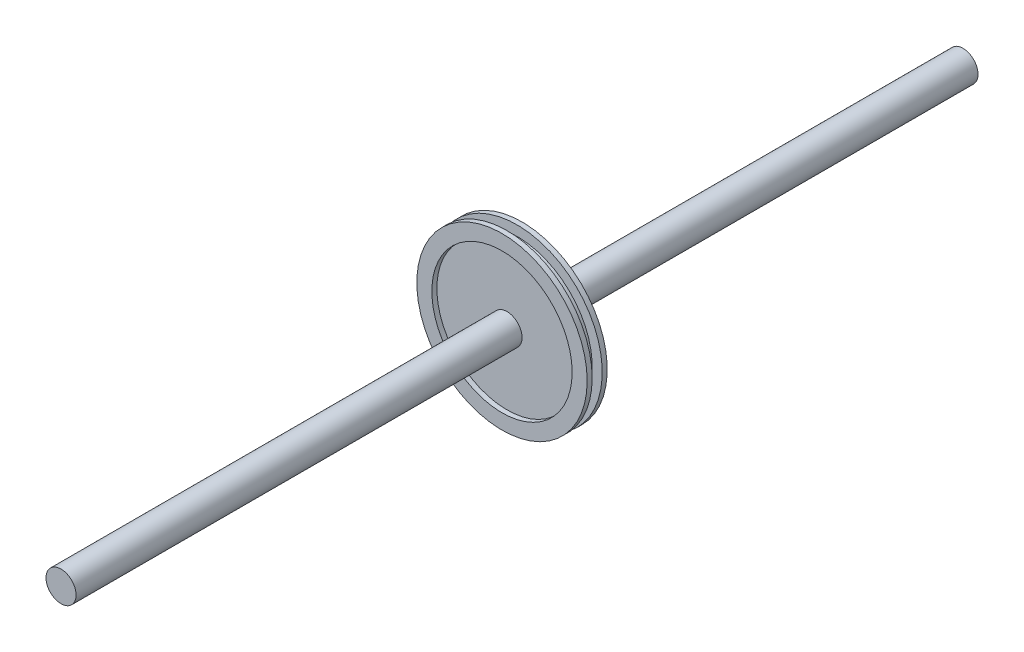
ISO-10303-21;
HEADER;
FILE_DESCRIPTION(('STEP AP214'),'2;1');
FILE_NAME('part.step','',(''),(''),'','','');
FILE_SCHEMA(('AUTOMOTIVE_DESIGN { 1 0 10303 214 1 1 1 1 }'));
ENDSEC;
DATA;
#1=APPLICATION_CONTEXT('core data for automotive mechanical design processes');
#2=APPLICATION_PROTOCOL_DEFINITION('international standard','automotive_design',2000,#1);
#3=PRODUCT_CONTEXT('',#1,'mechanical');
#4=PRODUCT('Part','Part','',(#3));
#5=PRODUCT_RELATED_PRODUCT_CATEGORY('part','',(#4));
#6=PRODUCT_DEFINITION_FORMATION('','',#4);
#7=PRODUCT_DEFINITION_CONTEXT('part definition',#1,'design');
#8=PRODUCT_DEFINITION('design','',#6,#7);
#9=PRODUCT_DEFINITION_SHAPE('','',#8);
#10=(LENGTH_UNIT() NAMED_UNIT(*) SI_UNIT(.MILLI.,.METRE.));
#11=(NAMED_UNIT(*) PLANE_ANGLE_UNIT() SI_UNIT($,.RADIAN.));
#12=(NAMED_UNIT(*) SI_UNIT($,.STERADIAN.) SOLID_ANGLE_UNIT());
#13=UNCERTAINTY_MEASURE_WITH_UNIT(LENGTH_MEASURE(1.E-05),#10,'distance_accuracy_value','');
#14=(GEOMETRIC_REPRESENTATION_CONTEXT(3) GLOBAL_UNCERTAINTY_ASSIGNED_CONTEXT((#13)) GLOBAL_UNIT_ASSIGNED_CONTEXT((#10,
#11,#12)) REPRESENTATION_CONTEXT('',''));
#15=CARTESIAN_POINT('',(0.,0.,0.));
#16=DIRECTION('',(0.,0.,1.));
#17=DIRECTION('',(1.,0.,0.));
#18=AXIS2_PLACEMENT_3D('',#15,#16,#17);
#19=CARTESIAN_POINT('',(0.,0.,0.5));
#20=DIRECTION('',(0.,0.,-1.));
#21=DIRECTION('',(-1.,0.,0.));
#22=AXIS2_PLACEMENT_3D('',#19,#20,#21);
#23=CYLINDRICAL_SURFACE('',#22,7.5);
#24=CARTESIAN_POINT('',(0.,0.,0.5));
#25=DIRECTION('',(0.,0.,1.));
#26=DIRECTION('',(1.,0.,0.));
#27=AXIS2_PLACEMENT_3D('',#24,#25,#26);
#28=CIRCLE('',#27,7.5);
#29=CARTESIAN_POINT('',(7.5,0.,0.5));
#30=VERTEX_POINT('',#29);
#31=EDGE_CURVE('E49',#30,#30,#28,.T.);
#32=ORIENTED_EDGE('',*,*,#31,.F.);
#33=EDGE_LOOP('',(#32));
#34=FACE_BOUND('',#33,.T.);
#35=CARTESIAN_POINT('',(0.,0.,-0.5));
#36=DIRECTION('',(0.,0.,-1.));
#37=DIRECTION('',(-1.,0.,0.));
#38=AXIS2_PLACEMENT_3D('',#35,#36,#37);
#39=CIRCLE('',#38,7.5);
#40=CARTESIAN_POINT('',(-7.5,0.,-0.5));
#41=VERTEX_POINT('',#40);
#42=EDGE_CURVE('E64',#41,#41,#39,.T.);
#43=ORIENTED_EDGE('',*,*,#42,.F.);
#44=EDGE_LOOP('',(#43));
#45=FACE_BOUND('',#44,.T.);
#46=ADVANCED_FACE('F39',(#34,#45),#23,.T.);
#47=CARTESIAN_POINT('',(0.,0.,1.));
#48=DIRECTION('',(0.,0.,1.));
#49=DIRECTION('',(1.,0.,0.));
#50=AXIS2_PLACEMENT_3D('',#47,#48,#49);
#51=PLANE('',#50);
#52=CARTESIAN_POINT('',(0.,0.,1.));
#53=DIRECTION('',(0.,0.,1.));
#54=DIRECTION('',(1.,0.,0.));
#55=AXIS2_PLACEMENT_3D('',#52,#53,#54);
#56=CIRCLE('',#55,8.5);
#57=CARTESIAN_POINT('',(8.5,0.,1.));
#58=VERTEX_POINT('',#57);
#59=EDGE_CURVE('E53',#58,#58,#56,.T.);
#60=ORIENTED_EDGE('',*,*,#59,.T.);
#61=EDGE_LOOP('',(#60));
#62=FACE_BOUND('',#61,.T.);
#63=CARTESIAN_POINT('',(0.,0.,1.));
#64=DIRECTION('',(0.,0.,1.));
#65=DIRECTION('',(1.,0.,0.));
#66=AXIS2_PLACEMENT_3D('',#63,#64,#65);
#67=CIRCLE('',#66,7.);
#68=CARTESIAN_POINT('',(7.,0.,1.));
#69=VERTEX_POINT('',#68);
#70=EDGE_CURVE('E59',#69,#69,#67,.T.);
#71=ORIENTED_EDGE('',*,*,#70,.F.);
#72=EDGE_LOOP('',(#71));
#73=FACE_BOUND('',#72,.T.);
#74=ADVANCED_FACE('F107',(#62,#73),#51,.T.);
#75=CARTESIAN_POINT('',(0.,0.,0.5));
#76=DIRECTION('',(0.,0.,1.));
#77=DIRECTION('',(1.,0.,0.));
#78=AXIS2_PLACEMENT_3D('',#75,#76,#77);
#79=PLANE('',#78);
#80=ORIENTED_EDGE('',*,*,#31,.T.);
#81=EDGE_LOOP('',(#80));
#82=FACE_BOUND('',#81,.T.);
#83=CARTESIAN_POINT('',(0.,0.,0.5));
#84=DIRECTION('',(0.,0.,1.));
#85=DIRECTION('',(1.,0.,0.));
#86=AXIS2_PLACEMENT_3D('',#83,#84,#85);
#87=CIRCLE('',#86,8.5);
#88=CARTESIAN_POINT('',(8.5,0.,0.5));
#89=VERTEX_POINT('',#88);
#90=EDGE_CURVE('E56',#89,#89,#87,.T.);
#91=ORIENTED_EDGE('',*,*,#90,.F.);
#92=EDGE_LOOP('',(#91));
#93=FACE_BOUND('',#92,.T.);
#94=ADVANCED_FACE('F112',(#82,#93),#79,.F.);
#95=CARTESIAN_POINT('',(0.,0.,1.));
#96=DIRECTION('',(0.,0.,-1.));
#97=DIRECTION('',(-1.,0.,0.));
#98=AXIS2_PLACEMENT_3D('',#95,#96,#97);
#99=CYLINDRICAL_SURFACE('',#98,8.5);
#100=ORIENTED_EDGE('',*,*,#59,.F.);
#101=EDGE_LOOP('',(#100));
#102=FACE_BOUND('',#101,.T.);
#103=ORIENTED_EDGE('',*,*,#90,.T.);
#104=EDGE_LOOP('',(#103));
#105=FACE_BOUND('',#104,.T.);
#106=ADVANCED_FACE('F142',(#102,#105),#99,.T.);
#107=CARTESIAN_POINT('',(0.,0.,1.));
#108=DIRECTION('',(0.,0.,-1.));
#109=DIRECTION('',(-1.,0.,0.));
#110=AXIS2_PLACEMENT_3D('',#107,#108,#109);
#111=CYLINDRICAL_SURFACE('',#110,7.);
#112=ORIENTED_EDGE('',*,*,#70,.T.);
#113=EDGE_LOOP('',(#112));
#114=FACE_BOUND('',#113,.T.);
#115=CARTESIAN_POINT('',(0.,0.,0.5));
#116=DIRECTION('',(0.,0.,1.));
#117=DIRECTION('',(1.,0.,0.));
#118=AXIS2_PLACEMENT_3D('',#115,#116,#117);
#119=CIRCLE('',#118,7.);
#120=CARTESIAN_POINT('',(7.,0.,0.5));
#121=VERTEX_POINT('',#120);
#122=EDGE_CURVE('E45',#121,#121,#119,.F.);
#123=ORIENTED_EDGE('',*,*,#122,.T.);
#124=EDGE_LOOP('',(#123));
#125=FACE_BOUND('',#124,.T.);
#126=ADVANCED_FACE('F139',(#114,#125),#111,.F.);
#127=CARTESIAN_POINT('',(0.,0.,0.5));
#128=DIRECTION('',(0.,0.,1.));
#129=DIRECTION('',(1.,0.,0.));
#130=AXIS2_PLACEMENT_3D('',#127,#128,#129);
#131=PLANE('',#130);
#132=CARTESIAN_POINT('',(0.,0.,0.5));
#133=DIRECTION('',(0.,0.,1.));
#134=DIRECTION('',(1.,0.,0.));
#135=AXIS2_PLACEMENT_3D('',#132,#133,#134);
#136=CIRCLE('',#135,1.5);
#137=CARTESIAN_POINT('',(-1.5,0.,0.499999999999994));
#138=VERTEX_POINT('',#137);
#139=EDGE_CURVE('E77',#138,#138,#136,.F.);
#140=ORIENTED_EDGE('',*,*,#139,.T.);
#141=EDGE_LOOP('',(#140));
#142=FACE_BOUND('',#141,.T.);
#143=ORIENTED_EDGE('',*,*,#122,.F.);
#144=EDGE_LOOP('',(#143));
#145=FACE_BOUND('',#144,.T.);
#146=ADVANCED_FACE('F141',(#142,#145),#131,.T.);
#147=CARTESIAN_POINT('',(0.,0.,-1.));
#148=DIRECTION('',(0.,0.,-1.));
#149=DIRECTION('',(-1.,0.,0.));
#150=AXIS2_PLACEMENT_3D('',#147,#148,#149);
#151=PLANE('',#150);
#152=CARTESIAN_POINT('',(0.,0.,-1.));
#153=DIRECTION('',(0.,0.,-1.));
#154=DIRECTION('',(-1.,0.,0.));
#155=AXIS2_PLACEMENT_3D('',#152,#153,#154);
#156=CIRCLE('',#155,8.5);
#157=CARTESIAN_POINT('',(-8.5,0.,-1.));
#158=VERTEX_POINT('',#157);
#159=EDGE_CURVE('E67',#158,#158,#156,.T.);
#160=ORIENTED_EDGE('',*,*,#159,.T.);
#161=EDGE_LOOP('',(#160));
#162=FACE_BOUND('',#161,.T.);
#163=CARTESIAN_POINT('',(0.,0.,-1.));
#164=DIRECTION('',(0.,0.,-1.));
#165=DIRECTION('',(-1.,0.,0.));
#166=AXIS2_PLACEMENT_3D('',#163,#164,#165);
#167=CIRCLE('',#166,7.);
#168=CARTESIAN_POINT('',(-7.,0.,-1.));
#169=VERTEX_POINT('',#168);
#170=EDGE_CURVE('E71',#169,#169,#167,.T.);
#171=ORIENTED_EDGE('',*,*,#170,.F.);
#172=EDGE_LOOP('',(#171));
#173=FACE_BOUND('',#172,.T.);
#174=ADVANCED_FACE('F123',(#162,#173),#151,.T.);
#175=CARTESIAN_POINT('',(0.,0.,-0.5));
#176=DIRECTION('',(0.,0.,-1.));
#177=DIRECTION('',(-1.,0.,0.));
#178=AXIS2_PLACEMENT_3D('',#175,#176,#177);
#179=PLANE('',#178);
#180=ORIENTED_EDGE('',*,*,#42,.T.);
#181=EDGE_LOOP('',(#180));
#182=FACE_BOUND('',#181,.T.);
#183=CARTESIAN_POINT('',(0.,0.,-0.5));
#184=DIRECTION('',(0.,0.,-1.));
#185=DIRECTION('',(-1.,0.,0.));
#186=AXIS2_PLACEMENT_3D('',#183,#184,#185);
#187=CIRCLE('',#186,8.5);
#188=CARTESIAN_POINT('',(-8.5,0.,-0.5));
#189=VERTEX_POINT('',#188);
#190=EDGE_CURVE('E68',#189,#189,#187,.T.);
#191=ORIENTED_EDGE('',*,*,#190,.F.);
#192=EDGE_LOOP('',(#191));
#193=FACE_BOUND('',#192,.T.);
#194=ADVANCED_FACE('F119',(#182,#193),#179,.F.);
#195=CARTESIAN_POINT('',(0.,0.,-1.));
#196=DIRECTION('',(0.,0.,1.));
#197=DIRECTION('',(1.,0.,0.));
#198=AXIS2_PLACEMENT_3D('',#195,#196,#197);
#199=CYLINDRICAL_SURFACE('',#198,8.5);
#200=ORIENTED_EDGE('',*,*,#159,.F.);
#201=EDGE_LOOP('',(#200));
#202=FACE_BOUND('',#201,.T.);
#203=ORIENTED_EDGE('',*,*,#190,.T.);
#204=EDGE_LOOP('',(#203));
#205=FACE_BOUND('',#204,.T.);
#206=ADVANCED_FACE('F122',(#202,#205),#199,.T.);
#207=CARTESIAN_POINT('',(0.,0.,-1.));
#208=DIRECTION('',(0.,0.,1.));
#209=DIRECTION('',(1.,0.,0.));
#210=AXIS2_PLACEMENT_3D('',#207,#208,#209);
#211=CYLINDRICAL_SURFACE('',#210,7.);
#212=ORIENTED_EDGE('',*,*,#170,.T.);
#213=EDGE_LOOP('',(#212));
#214=FACE_BOUND('',#213,.T.);
#215=CARTESIAN_POINT('',(0.,0.,-0.5));
#216=DIRECTION('',(0.,0.,-1.));
#217=DIRECTION('',(-1.,0.,0.));
#218=AXIS2_PLACEMENT_3D('',#215,#216,#217);
#219=CIRCLE('',#218,7.);
#220=CARTESIAN_POINT('',(-7.,0.,-0.5));
#221=VERTEX_POINT('',#220);
#222=EDGE_CURVE('E74',#221,#221,#219,.T.);
#223=ORIENTED_EDGE('',*,*,#222,.F.);
#224=EDGE_LOOP('',(#223));
#225=FACE_BOUND('',#224,.T.);
#226=ADVANCED_FACE('F128',(#214,#225),#211,.F.);
#227=CARTESIAN_POINT('',(0.,0.,-0.5));
#228=DIRECTION('',(0.,0.,1.));
#229=DIRECTION('',(1.,0.,0.));
#230=AXIS2_PLACEMENT_3D('',#227,#228,#229);
#231=PLANE('',#230);
#232=CARTESIAN_POINT('',(0.,0.,-0.5));
#233=DIRECTION('',(0.,0.,1.));
#234=DIRECTION('',(1.,0.,0.));
#235=AXIS2_PLACEMENT_3D('',#232,#233,#234);
#236=CIRCLE('',#235,1.5);
#237=CARTESIAN_POINT('',(-1.5,0.,-0.500000000000007));
#238=VERTEX_POINT('',#237);
#239=EDGE_CURVE('E10',#238,#238,#236,.F.);
#240=ORIENTED_EDGE('',*,*,#239,.F.);
#241=EDGE_LOOP('',(#240));
#242=FACE_BOUND('',#241,.T.);
#243=ORIENTED_EDGE('',*,*,#222,.T.);
#244=EDGE_LOOP('',(#243));
#245=FACE_BOUND('',#244,.T.);
#246=ADVANCED_FACE('F134',(#242,#245),#231,.F.);
#247=CARTESIAN_POINT('',(0.,0.,-45.));
#248=DIRECTION('',(0.,0.,1.));
#249=DIRECTION('',(1.,0.,0.));
#250=AXIS2_PLACEMENT_3D('',#247,#248,#249);
#251=PLANE('',#250);
#252=CARTESIAN_POINT('',(0.,0.,-45.));
#253=DIRECTION('',(0.,0.,1.));
#254=DIRECTION('',(1.,0.,0.));
#255=AXIS2_PLACEMENT_3D('',#252,#253,#254);
#256=CIRCLE('',#255,1.5);
#257=CARTESIAN_POINT('',(-1.5,0.,-45.));
#258=VERTEX_POINT('',#257);
#259=EDGE_CURVE('E83',#258,#258,#256,.T.);
#260=ORIENTED_EDGE('',*,*,#259,.F.);
#261=EDGE_LOOP('',(#260));
#262=FACE_BOUND('',#261,.T.);
#263=ADVANCED_FACE('F101',(#262),#251,.F.);
#264=CARTESIAN_POINT('',(0.,0.,45.));
#265=DIRECTION('',(0.,0.,-1.));
#266=DIRECTION('',(-1.,0.,0.));
#267=AXIS2_PLACEMENT_3D('',#264,#265,#266);
#268=CYLINDRICAL_SURFACE('',#267,1.5);
#269=CARTESIAN_POINT('',(-1.5,0.,-45.));
#270=CARTESIAN_POINT('',(-1.5,0.,-44.5364583333333));
#271=CARTESIAN_POINT('',(-1.5,0.,-44.0729166666667));
#272=CARTESIAN_POINT('',(-1.5,0.,-43.1458333333333));
#273=CARTESIAN_POINT('',(-1.5,0.,-42.6822916666667));
#274=CARTESIAN_POINT('',(-1.5,0.,-41.7552083333333));
#275=CARTESIAN_POINT('',(-1.5,0.,-41.2916666666667));
#276=CARTESIAN_POINT('',(-1.5,0.,-40.3645833333333));
#277=CARTESIAN_POINT('',(-1.5,0.,-39.9010416666667));
#278=CARTESIAN_POINT('',(-1.5,0.,-38.9739583333333));
#279=CARTESIAN_POINT('',(-1.5,0.,-38.5104166666667));
#280=CARTESIAN_POINT('',(-1.5,0.,-37.5833333333333));
#281=CARTESIAN_POINT('',(-1.5,0.,-37.1197916666667));
#282=CARTESIAN_POINT('',(-1.5,0.,-36.1927083333333));
#283=CARTESIAN_POINT('',(-1.5,0.,-35.7291666666667));
#284=CARTESIAN_POINT('',(-1.5,0.,-34.8020833333333));
#285=CARTESIAN_POINT('',(-1.5,0.,-34.3385416666667));
#286=CARTESIAN_POINT('',(-1.5,0.,-33.4114583333333));
#287=CARTESIAN_POINT('',(-1.5,0.,-32.9479166666667));
#288=CARTESIAN_POINT('',(-1.5,0.,-32.0208333333333));
#289=CARTESIAN_POINT('',(-1.5,0.,-31.5572916666667));
#290=CARTESIAN_POINT('',(-1.5,0.,-30.6302083333333));
#291=CARTESIAN_POINT('',(-1.5,0.,-30.1666666666667));
#292=CARTESIAN_POINT('',(-1.5,0.,-29.2395833333333));
#293=CARTESIAN_POINT('',(-1.5,0.,-28.7760416666667));
#294=CARTESIAN_POINT('',(-1.5,0.,-27.8489583333333));
#295=CARTESIAN_POINT('',(-1.5,0.,-27.3854166666667));
#296=CARTESIAN_POINT('',(-1.5,0.,-26.4583333333333));
#297=CARTESIAN_POINT('',(-1.5,0.,-25.9947916666667));
#298=CARTESIAN_POINT('',(-1.5,0.,-25.0677083333333));
#299=CARTESIAN_POINT('',(-1.5,0.,-24.6041666666667));
#300=CARTESIAN_POINT('',(-1.5,0.,-23.6770833333333));
#301=CARTESIAN_POINT('',(-1.5,0.,-23.2135416666667));
#302=CARTESIAN_POINT('',(-1.5,0.,-22.2864583333333));
#303=CARTESIAN_POINT('',(-1.5,0.,-21.8229166666667));
#304=CARTESIAN_POINT('',(-1.5,0.,-20.8958333333333));
#305=CARTESIAN_POINT('',(-1.5,0.,-20.4322916666667));
#306=CARTESIAN_POINT('',(-1.5,0.,-19.5052083333333));
#307=CARTESIAN_POINT('',(-1.5,0.,-19.0416666666667));
#308=CARTESIAN_POINT('',(-1.5,0.,-18.1145833333333));
#309=CARTESIAN_POINT('',(-1.5,0.,-17.6510416666667));
#310=CARTESIAN_POINT('',(-1.5,0.,-16.7239583333333));
#311=CARTESIAN_POINT('',(-1.5,0.,-16.2604166666667));
#312=CARTESIAN_POINT('',(-1.5,0.,-15.3333333333333));
#313=CARTESIAN_POINT('',(-1.5,0.,-14.8697916666667));
#314=CARTESIAN_POINT('',(-1.5,0.,-13.9427083333333));
#315=CARTESIAN_POINT('',(-1.5,0.,-13.4791666666667));
#316=CARTESIAN_POINT('',(-1.5,0.,-12.5520833333333));
#317=CARTESIAN_POINT('',(-1.5,0.,-12.0885416666667));
#318=CARTESIAN_POINT('',(-1.5,0.,-11.1614583333333));
#319=CARTESIAN_POINT('',(-1.5,0.,-10.6979166666667));
#320=CARTESIAN_POINT('',(-1.5,0.,-9.77083333333334));
#321=CARTESIAN_POINT('',(-1.5,0.,-9.30729166666668));
#322=CARTESIAN_POINT('',(-1.5,0.,-8.38020833333334));
#323=CARTESIAN_POINT('',(-1.5,0.,-7.91666666666668));
#324=CARTESIAN_POINT('',(-1.5,0.,-6.98958333333334));
#325=CARTESIAN_POINT('',(-1.5,0.,-6.52604166666667));
#326=CARTESIAN_POINT('',(-1.5,0.,-5.59895833333334));
#327=CARTESIAN_POINT('',(-1.5,0.,-5.13541666666667));
#328=CARTESIAN_POINT('',(-1.5,0.,-4.20833333333334));
#329=CARTESIAN_POINT('',(-1.5,0.,-3.74479166666667));
#330=CARTESIAN_POINT('',(-1.5,0.,-2.81770833333334));
#331=CARTESIAN_POINT('',(-1.5,0.,-2.35416666666667));
#332=CARTESIAN_POINT('',(-1.5,0.,-1.42708333333334));
#333=CARTESIAN_POINT('',(-1.5,0.,-0.963541666666674));
#334=CARTESIAN_POINT('',(-1.5,0.,-0.500000000000007));
#335=B_SPLINE_CURVE_WITH_KNOTS('',3,(#269,#270,#271,#272,#273,#274,#275,#276,#277,#278,#279,
#280,#281,#282,#283,#284,#285,#286,#287,#288,#289,#290,#291,#292,#293,#294,#295,#296,#297,#298,
#299,#300,#301,#302,#303,#304,#305,#306,#307,#308,#309,#310,#311,#312,#313,#314,#315,#316,#317,
#318,#319,#320,#321,#322,#323,#324,#325,#326,#327,#328,#329,#330,#331,#332,#333,#334),
.UNSPECIFIED.,.F.,.F.,(4,2,2,2,2,2,2,2,2,2,2,2,2,2,2,2,2,2,2,2,2,2,2,2,2,2,2,2,2,2,2,2,4),(0.,
1.39062500000001,2.78125,4.17187500000001,5.5625,6.953125,8.34375,9.734375,11.125,12.515625,
13.90625,15.296875,16.6875,18.078125,19.46875,20.859375,22.25,23.640625,25.03125,26.421875,
27.8125,29.203125,30.59375,31.984375,33.375,34.765625,36.15625,37.546875,38.9375,40.328125,
41.71875,43.109375,44.5),.UNSPECIFIED.);
#336=EDGE_CURVE('BSEAM93',#258,#238,#335,.T.);
#337=ORIENTED_EDGE('',*,*,#259,.T.);
#338=ORIENTED_EDGE('',*,*,#239,.T.);
#339=ORIENTED_EDGE('',*,*,#336,.T.);
#340=ORIENTED_EDGE('',*,*,#336,.F.);
#341=EDGE_LOOP('',(#337,#339,#338,#340));
#342=FACE_BOUND('',#341,.T.);
#343=ADVANCED_FACE('F93',(#342),#268,.T.);
#344=CARTESIAN_POINT('',(0.,0.,45.));
#345=DIRECTION('',(0.,0.,1.));
#346=DIRECTION('',(1.,0.,0.));
#347=AXIS2_PLACEMENT_3D('',#344,#345,#346);
#348=CIRCLE('',#347,1.5);
#349=CARTESIAN_POINT('',(-1.5,0.,45.));
#350=VERTEX_POINT('',#349);
#351=EDGE_CURVE('E82',#350,#350,#348,.T.);
#352=CARTESIAN_POINT('',(-1.5,0.,0.499999999999994));
#353=CARTESIAN_POINT('',(-1.5,0.,0.963541666666661));
#354=CARTESIAN_POINT('',(-1.5,0.,1.42708333333333));
#355=CARTESIAN_POINT('',(-1.5,0.,2.35416666666666));
#356=CARTESIAN_POINT('',(-1.5,0.,2.81770833333333));
#357=CARTESIAN_POINT('',(-1.5,0.,3.74479166666666));
#358=CARTESIAN_POINT('',(-1.5,0.,4.20833333333333));
#359=CARTESIAN_POINT('',(-1.5,0.,5.13541666666666));
#360=CARTESIAN_POINT('',(-1.5,0.,5.59895833333333));
#361=CARTESIAN_POINT('',(-1.5,0.,6.52604166666666));
#362=CARTESIAN_POINT('',(-1.5,0.,6.98958333333333));
#363=CARTESIAN_POINT('',(-1.5,0.,7.91666666666666));
#364=CARTESIAN_POINT('',(-1.5,0.,8.38020833333333));
#365=CARTESIAN_POINT('',(-1.5,0.,9.30729166666666));
#366=CARTESIAN_POINT('',(-1.5,0.,9.77083333333333));
#367=CARTESIAN_POINT('',(-1.5,0.,10.6979166666667));
#368=CARTESIAN_POINT('',(-1.5,0.,11.1614583333333));
#369=CARTESIAN_POINT('',(-1.5,0.,12.0885416666667));
#370=CARTESIAN_POINT('',(-1.5,0.,12.5520833333333));
#371=CARTESIAN_POINT('',(-1.5,0.,13.4791666666667));
#372=CARTESIAN_POINT('',(-1.5,0.,13.9427083333333));
#373=CARTESIAN_POINT('',(-1.5,0.,14.8697916666667));
#374=CARTESIAN_POINT('',(-1.5,0.,15.3333333333333));
#375=CARTESIAN_POINT('',(-1.5,0.,16.2604166666667));
#376=CARTESIAN_POINT('',(-1.5,0.,16.7239583333333));
#377=CARTESIAN_POINT('',(-1.5,0.,17.6510416666667));
#378=CARTESIAN_POINT('',(-1.5,0.,18.1145833333333));
#379=CARTESIAN_POINT('',(-1.5,0.,19.0416666666667));
#380=CARTESIAN_POINT('',(-1.5,0.,19.5052083333333));
#381=CARTESIAN_POINT('',(-1.5,0.,20.4322916666667));
#382=CARTESIAN_POINT('',(-1.5,0.,20.8958333333333));
#383=CARTESIAN_POINT('',(-1.5,0.,21.8229166666667));
#384=CARTESIAN_POINT('',(-1.5,0.,22.2864583333333));
#385=CARTESIAN_POINT('',(-1.5,0.,23.2135416666667));
#386=CARTESIAN_POINT('',(-1.5,0.,23.6770833333333));
#387=CARTESIAN_POINT('',(-1.5,0.,24.6041666666667));
#388=CARTESIAN_POINT('',(-1.5,0.,25.0677083333333));
#389=CARTESIAN_POINT('',(-1.5,0.,25.9947916666667));
#390=CARTESIAN_POINT('',(-1.5,0.,26.4583333333333));
#391=CARTESIAN_POINT('',(-1.5,0.,27.3854166666667));
#392=CARTESIAN_POINT('',(-1.5,0.,27.8489583333333));
#393=CARTESIAN_POINT('',(-1.5,0.,28.7760416666667));
#394=CARTESIAN_POINT('',(-1.5,0.,29.2395833333333));
#395=CARTESIAN_POINT('',(-1.5,0.,30.1666666666667));
#396=CARTESIAN_POINT('',(-1.5,0.,30.6302083333333));
#397=CARTESIAN_POINT('',(-1.5,0.,31.5572916666667));
#398=CARTESIAN_POINT('',(-1.5,0.,32.0208333333333));
#399=CARTESIAN_POINT('',(-1.5,0.,32.9479166666667));
#400=CARTESIAN_POINT('',(-1.5,0.,33.4114583333333));
#401=CARTESIAN_POINT('',(-1.5,0.,34.3385416666667));
#402=CARTESIAN_POINT('',(-1.5,0.,34.8020833333333));
#403=CARTESIAN_POINT('',(-1.5,0.,35.7291666666667));
#404=CARTESIAN_POINT('',(-1.5,0.,36.1927083333333));
#405=CARTESIAN_POINT('',(-1.5,0.,37.1197916666667));
#406=CARTESIAN_POINT('',(-1.5,0.,37.5833333333333));
#407=CARTESIAN_POINT('',(-1.5,0.,38.5104166666667));
#408=CARTESIAN_POINT('',(-1.5,0.,38.9739583333333));
#409=CARTESIAN_POINT('',(-1.5,0.,39.9010416666667));
#410=CARTESIAN_POINT('',(-1.5,0.,40.3645833333333));
#411=CARTESIAN_POINT('',(-1.5,0.,41.2916666666667));
#412=CARTESIAN_POINT('',(-1.5,0.,41.7552083333333));
#413=CARTESIAN_POINT('',(-1.5,0.,42.6822916666667));
#414=CARTESIAN_POINT('',(-1.5,0.,43.1458333333333));
#415=CARTESIAN_POINT('',(-1.5,0.,44.0729166666667));
#416=CARTESIAN_POINT('',(-1.5,0.,44.5364583333333));
#417=CARTESIAN_POINT('',(-1.5,0.,45.));
#418=B_SPLINE_CURVE_WITH_KNOTS('',3,(#352,#353,#354,#355,#356,#357,#358,#359,#360,#361,#362,
#363,#364,#365,#366,#367,#368,#369,#370,#371,#372,#373,#374,#375,#376,#377,#378,#379,#380,#381,
#382,#383,#384,#385,#386,#387,#388,#389,#390,#391,#392,#393,#394,#395,#396,#397,#398,#399,#400,
#401,#402,#403,#404,#405,#406,#407,#408,#409,#410,#411,#412,#413,#414,#415,#416,#417),
.UNSPECIFIED.,.F.,.F.,(4,2,2,2,2,2,2,2,2,2,2,2,2,2,2,2,2,2,2,2,2,2,2,2,2,2,2,2,2,2,2,2,4),(0.,
1.390625,2.78125,4.171875,5.5625,6.953125,8.34375,9.734375,11.125,12.515625,13.90625,15.296875,
16.6875,18.078125,19.46875,20.859375,22.25,23.640625,25.03125,26.421875,27.8125,29.203125,
30.59375,31.984375,33.375,34.765625,36.15625,37.546875,38.9375,40.328125,41.71875,43.109375,
44.5),.UNSPECIFIED.);
#419=EDGE_CURVE('BSEAM91',#138,#350,#418,.T.);
#420=ORIENTED_EDGE('',*,*,#139,.F.);
#421=ORIENTED_EDGE('',*,*,#351,.F.);
#422=ORIENTED_EDGE('',*,*,#419,.T.);
#423=ORIENTED_EDGE('',*,*,#419,.F.);
#424=EDGE_LOOP('',(#420,#422,#421,#423));
#425=FACE_BOUND('',#424,.T.);
#426=ADVANCED_FACE('F91',(#425),#268,.T.);
#427=CARTESIAN_POINT('',(0.,0.,45.));
#428=DIRECTION('',(0.,0.,1.));
#429=DIRECTION('',(1.,0.,0.));
#430=AXIS2_PLACEMENT_3D('',#427,#428,#429);
#431=PLANE('',#430);
#432=ORIENTED_EDGE('',*,*,#351,.T.);
#433=EDGE_LOOP('',(#432));
#434=FACE_BOUND('',#433,.T.);
#435=ADVANCED_FACE('F89',(#434),#431,.T.);
#436=CLOSED_SHELL('',(#46,#74,#94,#106,#126,#146,#174,#194,#206,#226,#246,#263,#343,#426,#435));
#437=MANIFOLD_SOLID_BREP('B2',#436);
#438=ADVANCED_BREP_SHAPE_REPRESENTATION('',(#18,#437),#14);
#439=SHAPE_DEFINITION_REPRESENTATION(#9,#438);
ENDSEC;
END-ISO-10303-21;
